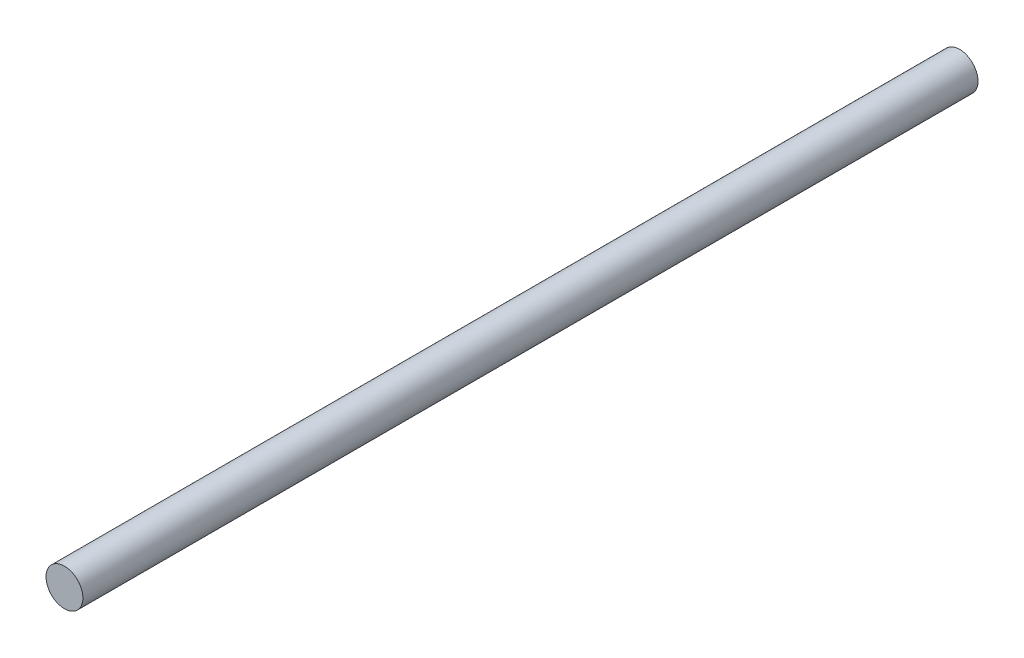
ISO-10303-21;
HEADER;
FILE_DESCRIPTION(('STEP AP214'),'2;1');
FILE_NAME('part.step','',(''),(''),'','','');
FILE_SCHEMA(('AUTOMOTIVE_DESIGN { 1 0 10303 214 1 1 1 1 }'));
ENDSEC;
DATA;
#1=APPLICATION_CONTEXT('core data for automotive mechanical design processes');
#2=APPLICATION_PROTOCOL_DEFINITION('international standard','automotive_design',2000,#1);
#3=PRODUCT_CONTEXT('',#1,'mechanical');
#4=PRODUCT('Part','Part','',(#3));
#5=PRODUCT_RELATED_PRODUCT_CATEGORY('part','',(#4));
#6=PRODUCT_DEFINITION_FORMATION('','',#4);
#7=PRODUCT_DEFINITION_CONTEXT('part definition',#1,'design');
#8=PRODUCT_DEFINITION('design','',#6,#7);
#9=PRODUCT_DEFINITION_SHAPE('','',#8);
#10=(LENGTH_UNIT() NAMED_UNIT(*) SI_UNIT(.MILLI.,.METRE.));
#11=(NAMED_UNIT(*) PLANE_ANGLE_UNIT() SI_UNIT($,.RADIAN.));
#12=(NAMED_UNIT(*) SI_UNIT($,.STERADIAN.) SOLID_ANGLE_UNIT());
#13=UNCERTAINTY_MEASURE_WITH_UNIT(LENGTH_MEASURE(1.E-05),#10,'distance_accuracy_value','');
#14=(GEOMETRIC_REPRESENTATION_CONTEXT(3) GLOBAL_UNCERTAINTY_ASSIGNED_CONTEXT((#13)) GLOBAL_UNIT_ASSIGNED_CONTEXT((#10,
#11,#12)) REPRESENTATION_CONTEXT('',''));
#15=CARTESIAN_POINT('',(0.,0.,0.));
#16=DIRECTION('',(0.,0.,1.));
#17=DIRECTION('',(1.,0.,0.));
#18=AXIS2_PLACEMENT_3D('',#15,#16,#17);
#19=CARTESIAN_POINT('',(0.,0.,194.));
#20=DIRECTION('',(0.,0.,-1.));
#21=DIRECTION('',(-1.,0.,0.));
#22=AXIS2_PLACEMENT_3D('',#19,#20,#21);
#23=CYLINDRICAL_SURFACE('',#22,4.);
#24=CARTESIAN_POINT('',(0.,0.,194.));
#25=DIRECTION('',(0.,0.,1.));
#26=DIRECTION('',(1.,0.,0.));
#27=AXIS2_PLACEMENT_3D('',#24,#25,#26);
#28=CIRCLE('',#27,4.);
#29=CARTESIAN_POINT('',(-4.,0.,194.));
#30=VERTEX_POINT('',#29);
#31=EDGE_CURVE('E10',#30,#30,#28,.T.);
#32=CARTESIAN_POINT('',(0.,0.,0.));
#33=DIRECTION('',(0.,0.,1.));
#34=DIRECTION('',(1.,0.,0.));
#35=AXIS2_PLACEMENT_3D('',#32,#33,#34);
#36=CIRCLE('',#35,4.);
#37=CARTESIAN_POINT('',(-4.,0.,0.));
#38=VERTEX_POINT('',#37);
#39=EDGE_CURVE('E33',#38,#38,#36,.T.);
#40=CARTESIAN_POINT('',(-4.,0.,194.));
#41=CARTESIAN_POINT('',(-4.,0.,191.979166666667));
#42=CARTESIAN_POINT('',(-4.,0.,189.958333333333));
#43=CARTESIAN_POINT('',(-4.,0.,185.916666666667));
#44=CARTESIAN_POINT('',(-4.,0.,183.895833333333));
#45=CARTESIAN_POINT('',(-4.,0.,179.854166666667));
#46=CARTESIAN_POINT('',(-4.,0.,177.833333333333));
#47=CARTESIAN_POINT('',(-4.,0.,173.791666666667));
#48=CARTESIAN_POINT('',(-4.,0.,171.770833333333));
#49=CARTESIAN_POINT('',(-4.,0.,167.729166666667));
#50=CARTESIAN_POINT('',(-4.,0.,165.708333333333));
#51=CARTESIAN_POINT('',(-4.,0.,161.666666666667));
#52=CARTESIAN_POINT('',(-4.,0.,159.645833333333));
#53=CARTESIAN_POINT('',(-4.,0.,155.604166666667));
#54=CARTESIAN_POINT('',(-4.,0.,153.583333333333));
#55=CARTESIAN_POINT('',(-4.,0.,149.541666666667));
#56=CARTESIAN_POINT('',(-4.,0.,147.520833333333));
#57=CARTESIAN_POINT('',(-4.,0.,143.479166666667));
#58=CARTESIAN_POINT('',(-4.,0.,141.458333333333));
#59=CARTESIAN_POINT('',(-4.,0.,137.416666666667));
#60=CARTESIAN_POINT('',(-4.,0.,135.395833333333));
#61=CARTESIAN_POINT('',(-4.,0.,131.354166666667));
#62=CARTESIAN_POINT('',(-4.,0.,129.333333333333));
#63=CARTESIAN_POINT('',(-4.,0.,125.291666666667));
#64=CARTESIAN_POINT('',(-4.,0.,123.270833333333));
#65=CARTESIAN_POINT('',(-4.,0.,119.229166666667));
#66=CARTESIAN_POINT('',(-4.,0.,117.208333333333));
#67=CARTESIAN_POINT('',(-4.,0.,113.166666666667));
#68=CARTESIAN_POINT('',(-4.,0.,111.145833333333));
#69=CARTESIAN_POINT('',(-4.,0.,107.104166666667));
#70=CARTESIAN_POINT('',(-4.,0.,105.083333333333));
#71=CARTESIAN_POINT('',(-4.,0.,101.041666666667));
#72=CARTESIAN_POINT('',(-4.,0.,99.0208333333333));
#73=CARTESIAN_POINT('',(-4.,0.,94.9791666666667));
#74=CARTESIAN_POINT('',(-4.,0.,92.9583333333333));
#75=CARTESIAN_POINT('',(-4.,0.,88.9166666666667));
#76=CARTESIAN_POINT('',(-4.,0.,86.8958333333333));
#77=CARTESIAN_POINT('',(-4.,0.,82.8541666666667));
#78=CARTESIAN_POINT('',(-4.,0.,80.8333333333333));
#79=CARTESIAN_POINT('',(-4.,0.,76.7916666666666));
#80=CARTESIAN_POINT('',(-4.,0.,74.7708333333333));
#81=CARTESIAN_POINT('',(-4.,0.,70.7291666666666));
#82=CARTESIAN_POINT('',(-4.,0.,68.7083333333333));
#83=CARTESIAN_POINT('',(-4.,0.,64.6666666666667));
#84=CARTESIAN_POINT('',(-4.,0.,62.6458333333333));
#85=CARTESIAN_POINT('',(-4.,0.,58.6041666666667));
#86=CARTESIAN_POINT('',(-4.,0.,56.5833333333333));
#87=CARTESIAN_POINT('',(-4.,0.,52.5416666666667));
#88=CARTESIAN_POINT('',(-4.,0.,50.5208333333333));
#89=CARTESIAN_POINT('',(-4.,0.,46.4791666666667));
#90=CARTESIAN_POINT('',(-4.,0.,44.4583333333333));
#91=CARTESIAN_POINT('',(-4.,0.,40.4166666666667));
#92=CARTESIAN_POINT('',(-4.,0.,38.3958333333333));
#93=CARTESIAN_POINT('',(-4.,0.,34.3541666666667));
#94=CARTESIAN_POINT('',(-4.,0.,32.3333333333333));
#95=CARTESIAN_POINT('',(-4.,0.,28.2916666666666));
#96=CARTESIAN_POINT('',(-4.,0.,26.2708333333333));
#97=CARTESIAN_POINT('',(-4.,0.,22.2291666666666));
#98=CARTESIAN_POINT('',(-4.,0.,20.2083333333333));
#99=CARTESIAN_POINT('',(-4.,0.,16.1666666666666));
#100=CARTESIAN_POINT('',(-4.,0.,14.1458333333333));
#101=CARTESIAN_POINT('',(-4.,0.,10.1041666666666));
#102=CARTESIAN_POINT('',(-4.,0.,8.0833333333333));
#103=CARTESIAN_POINT('',(-4.,0.,4.04166666666664));
#104=CARTESIAN_POINT('',(-4.,0.,2.02083333333331));
#105=CARTESIAN_POINT('',(-4.,0.,0.));
#106=B_SPLINE_CURVE_WITH_KNOTS('',3,(#40,#41,#42,#43,#44,#45,#46,#47,#48,#49,#50,#51,#52,#53,
#54,#55,#56,#57,#58,#59,#60,#61,#62,#63,#64,#65,#66,#67,#68,#69,#70,#71,#72,#73,#74,#75,#76,#77,
#78,#79,#80,#81,#82,#83,#84,#85,#86,#87,#88,#89,#90,#91,#92,#93,#94,#95,#96,#97,#98,#99,#100,
#101,#102,#103,#104,#105),.UNSPECIFIED.,.F.,.F.,(4,2,2,2,2,2,2,2,2,2,2,2,2,2,2,2,2,2,2,2,2,2,2,
2,2,2,2,2,2,2,2,2,4),(0.,6.0625,12.125,18.1875,24.25,30.3125,36.375,42.4375,48.5,54.5625,60.625,
66.6875,72.75,78.8125,84.875,90.9375,97.,103.0625,109.125,115.1875,121.25,127.3125,133.375,
139.4375,145.5,151.5625,157.625,163.6875,169.75,175.8125,181.875,187.9375,194.),.UNSPECIFIED.);
#107=EDGE_CURVE('BSEAM30',#30,#38,#106,.T.);
#108=ORIENTED_EDGE('',*,*,#31,.F.);
#109=ORIENTED_EDGE('',*,*,#39,.T.);
#110=ORIENTED_EDGE('',*,*,#107,.T.);
#111=ORIENTED_EDGE('',*,*,#107,.F.);
#112=EDGE_LOOP('',(#108,#110,#109,#111));
#113=FACE_BOUND('',#112,.T.);
#114=ADVANCED_FACE('F30',(#113),#23,.T.);
#115=CARTESIAN_POINT('',(0.,0.,194.));
#116=DIRECTION('',(0.,0.,1.));
#117=DIRECTION('',(1.,0.,0.));
#118=AXIS2_PLACEMENT_3D('',#115,#116,#117);
#119=PLANE('',#118);
#120=ORIENTED_EDGE('',*,*,#31,.T.);
#121=EDGE_LOOP('',(#120));
#122=FACE_BOUND('',#121,.T.);
#123=ADVANCED_FACE('F45',(#122),#119,.T.);
#124=CARTESIAN_POINT('',(0.,0.,0.));
#125=DIRECTION('',(0.,0.,1.));
#126=DIRECTION('',(1.,0.,0.));
#127=AXIS2_PLACEMENT_3D('',#124,#125,#126);
#128=PLANE('',#127);
#129=ORIENTED_EDGE('',*,*,#39,.F.);
#130=EDGE_LOOP('',(#129));
#131=FACE_BOUND('',#130,.T.);
#132=ADVANCED_FACE('F43',(#131),#128,.F.);
#133=CLOSED_SHELL('',(#114,#123,#132));
#134=MANIFOLD_SOLID_BREP('B2',#133);
#135=ADVANCED_BREP_SHAPE_REPRESENTATION('',(#18,#134),#14);
#136=SHAPE_DEFINITION_REPRESENTATION(#9,#135);
ENDSEC;
END-ISO-10303-21;
